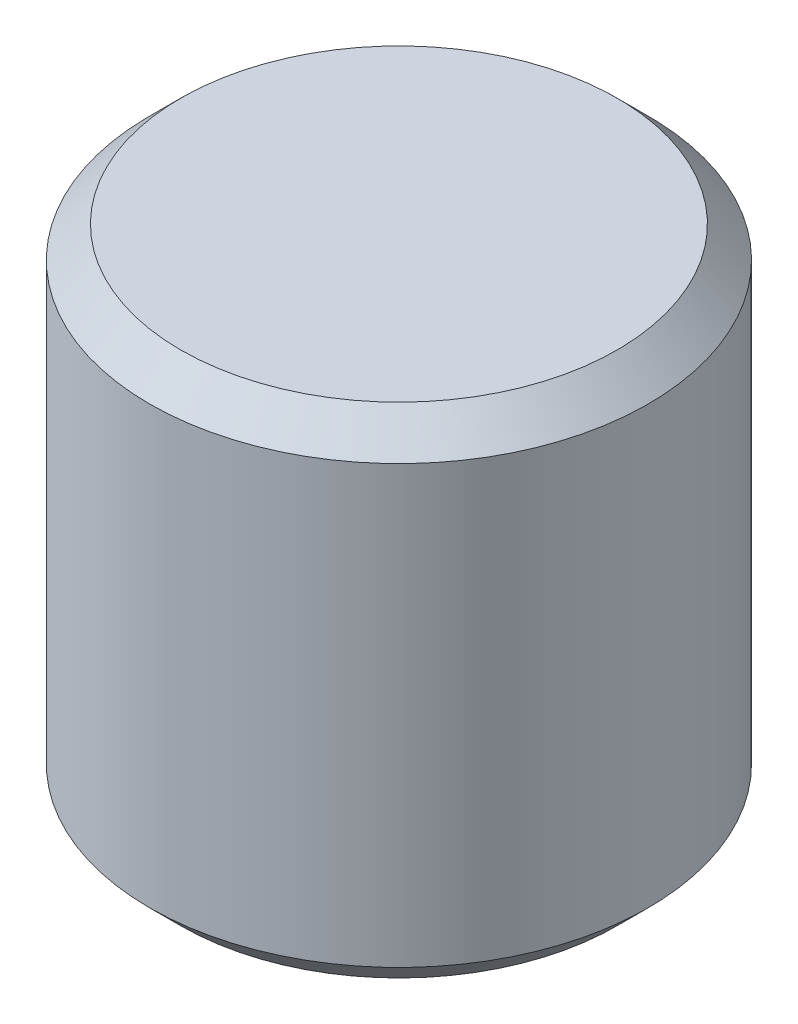
ISO-10303-21;
HEADER;
FILE_DESCRIPTION(('STEP AP214'),'2;1');
FILE_NAME('part.step','',(''),(''),'','','');
FILE_SCHEMA(('AUTOMOTIVE_DESIGN { 1 0 10303 214 1 1 1 1 }'));
ENDSEC;
DATA;
#1=APPLICATION_CONTEXT('core data for automotive mechanical design processes');
#2=APPLICATION_PROTOCOL_DEFINITION('international standard','automotive_design',2000,#1);
#3=PRODUCT_CONTEXT('',#1,'mechanical');
#4=PRODUCT('Part','Part','',(#3));
#5=PRODUCT_RELATED_PRODUCT_CATEGORY('part','',(#4));
#6=PRODUCT_DEFINITION_FORMATION('','',#4);
#7=PRODUCT_DEFINITION_CONTEXT('part definition',#1,'design');
#8=PRODUCT_DEFINITION('design','',#6,#7);
#9=PRODUCT_DEFINITION_SHAPE('','',#8);
#10=(LENGTH_UNIT() NAMED_UNIT(*) SI_UNIT(.MILLI.,.METRE.));
#11=(NAMED_UNIT(*) PLANE_ANGLE_UNIT() SI_UNIT($,.RADIAN.));
#12=(NAMED_UNIT(*) SI_UNIT($,.STERADIAN.) SOLID_ANGLE_UNIT());
#13=UNCERTAINTY_MEASURE_WITH_UNIT(LENGTH_MEASURE(1.E-05),#10,'distance_accuracy_value','');
#14=(GEOMETRIC_REPRESENTATION_CONTEXT(3) GLOBAL_UNCERTAINTY_ASSIGNED_CONTEXT((#13)) GLOBAL_UNIT_ASSIGNED_CONTEXT((#10,
#11,#12)) REPRESENTATION_CONTEXT('',''));
#15=CARTESIAN_POINT('',(0.,0.,0.));
#16=DIRECTION('',(0.,0.,1.));
#17=DIRECTION('',(1.,0.,0.));
#18=AXIS2_PLACEMENT_3D('',#15,#16,#17);
#19=CARTESIAN_POINT('',(0.,4.,0.));
#20=DIRECTION('',(0.,-1.,0.));
#21=DIRECTION('',(0.,0.,-1.));
#22=AXIS2_PLACEMENT_3D('',#19,#20,#21);
#23=CYLINDRICAL_SURFACE('',#22,2.);
#24=CARTESIAN_POINT('',(0.,0.249999999999999,0.));
#25=DIRECTION('',(0.,1.,0.));
#26=DIRECTION('',(0.,0.,1.));
#27=AXIS2_PLACEMENT_3D('',#24,#25,#26);
#28=CIRCLE('',#27,2.);
#29=CARTESIAN_POINT('',(0.,0.249999999999999,2.));
#30=VERTEX_POINT('',#29);
#31=EDGE_CURVE('E42',#30,#30,#28,.T.);
#32=ORIENTED_EDGE('',*,*,#31,.T.);
#33=EDGE_LOOP('',(#32));
#34=FACE_BOUND('',#33,.T.);
#35=CARTESIAN_POINT('',(0.,3.75,0.));
#36=DIRECTION('',(0.,1.,0.));
#37=DIRECTION('',(0.,0.,1.));
#38=AXIS2_PLACEMENT_3D('',#35,#36,#37);
#39=CIRCLE('',#38,2.);
#40=CARTESIAN_POINT('',(0.,3.75,2.));
#41=VERTEX_POINT('',#40);
#42=EDGE_CURVE('E46',#41,#41,#39,.F.);
#43=ORIENTED_EDGE('',*,*,#42,.T.);
#44=EDGE_LOOP('',(#43));
#45=FACE_BOUND('',#44,.T.);
#46=ADVANCED_FACE('F31',(#34,#45),#23,.T.);
#47=CARTESIAN_POINT('',(0.,4.,0.));
#48=DIRECTION('',(0.,1.,0.));
#49=DIRECTION('',(0.,0.,1.));
#50=AXIS2_PLACEMENT_3D('',#47,#48,#49);
#51=PLANE('',#50);
#52=CARTESIAN_POINT('',(0.,4.,0.));
#53=DIRECTION('',(0.,1.,0.));
#54=DIRECTION('',(0.,0.,1.));
#55=AXIS2_PLACEMENT_3D('',#52,#53,#54);
#56=CIRCLE('',#55,1.75);
#57=CARTESIAN_POINT('',(0.,4.,1.75));
#58=VERTEX_POINT('',#57);
#59=EDGE_CURVE('E10',#58,#58,#56,.T.);
#60=ORIENTED_EDGE('',*,*,#59,.T.);
#61=EDGE_LOOP('',(#60));
#62=FACE_BOUND('',#61,.T.);
#63=ADVANCED_FACE('F62',(#62),#51,.T.);
#64=CARTESIAN_POINT('',(0.,0.,0.));
#65=DIRECTION('',(0.,1.,0.));
#66=DIRECTION('',(0.,0.,1.));
#67=AXIS2_PLACEMENT_3D('',#64,#65,#66);
#68=PLANE('',#67);
#69=CARTESIAN_POINT('',(0.,0.,0.));
#70=DIRECTION('',(0.,1.,0.));
#71=DIRECTION('',(0.,0.,1.));
#72=AXIS2_PLACEMENT_3D('',#69,#70,#71);
#73=CIRCLE('',#72,1.75);
#74=CARTESIAN_POINT('',(0.,0.,1.75));
#75=VERTEX_POINT('',#74);
#76=EDGE_CURVE('E38',#75,#75,#73,.F.);
#77=ORIENTED_EDGE('',*,*,#76,.T.);
#78=EDGE_LOOP('',(#77));
#79=FACE_BOUND('',#78,.T.);
#80=ADVANCED_FACE('F59',(#79),#68,.F.);
#81=CARTESIAN_POINT('',(0.,0.249999999999999,0.));
#82=DIRECTION('',(0.,1.,0.));
#83=DIRECTION('',(0.,0.,1.));
#84=AXIS2_PLACEMENT_3D('',#81,#82,#83);
#85=CONICAL_SURFACE('',#84,2.,0.785398163397449);
#86=ORIENTED_EDGE('',*,*,#76,.F.);
#87=EDGE_LOOP('',(#86));
#88=FACE_BOUND('',#87,.T.);
#89=ORIENTED_EDGE('',*,*,#31,.F.);
#90=EDGE_LOOP('',(#89));
#91=FACE_BOUND('',#90,.T.);
#92=ADVANCED_FACE('F55',(#88,#91),#85,.T.);
#93=CARTESIAN_POINT('',(0.,4.,0.));
#94=DIRECTION('',(0.,-1.,0.));
#95=DIRECTION('',(0.,0.,-1.));
#96=AXIS2_PLACEMENT_3D('',#93,#94,#95);
#97=CONICAL_SURFACE('',#96,1.75,0.785398163397447);
#98=ORIENTED_EDGE('',*,*,#42,.F.);
#99=EDGE_LOOP('',(#98));
#100=FACE_BOUND('',#99,.T.);
#101=ORIENTED_EDGE('',*,*,#59,.F.);
#102=EDGE_LOOP('',(#101));
#103=FACE_BOUND('',#102,.T.);
#104=ADVANCED_FACE('F33',(#100,#103),#97,.T.);
#105=CLOSED_SHELL('',(#46,#63,#80,#92,#104));
#106=MANIFOLD_SOLID_BREP('B2',#105);
#107=ADVANCED_BREP_SHAPE_REPRESENTATION('',(#18,#106),#14);
#108=SHAPE_DEFINITION_REPRESENTATION(#9,#107);
ENDSEC;
END-ISO-10303-21;
